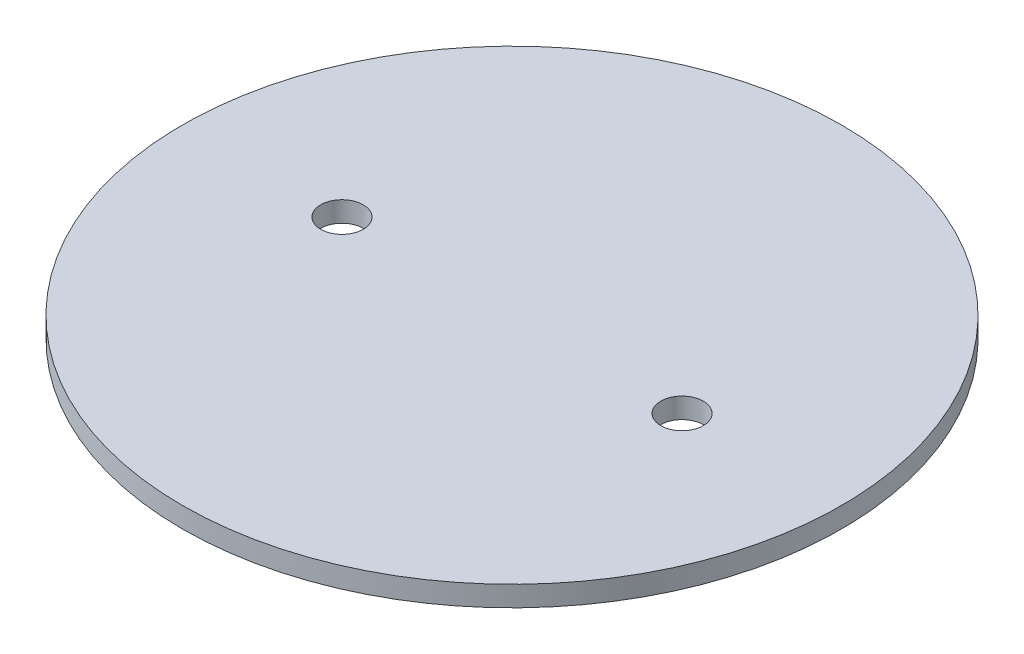
ISO-10303-21;
HEADER;
FILE_DESCRIPTION(('STEP AP214'),'2;1');
FILE_NAME('part.step','',(''),(''),'','','');
FILE_SCHEMA(('AUTOMOTIVE_DESIGN { 1 0 10303 214 1 1 1 1 }'));
ENDSEC;
DATA;
#1=APPLICATION_CONTEXT('core data for automotive mechanical design processes');
#2=APPLICATION_PROTOCOL_DEFINITION('international standard','automotive_design',2000,#1);
#3=PRODUCT_CONTEXT('',#1,'mechanical');
#4=PRODUCT('Part','Part','',(#3));
#5=PRODUCT_RELATED_PRODUCT_CATEGORY('part','',(#4));
#6=PRODUCT_DEFINITION_FORMATION('','',#4);
#7=PRODUCT_DEFINITION_CONTEXT('part definition',#1,'design');
#8=PRODUCT_DEFINITION('design','',#6,#7);
#9=PRODUCT_DEFINITION_SHAPE('','',#8);
#10=(LENGTH_UNIT() NAMED_UNIT(*) SI_UNIT(.MILLI.,.METRE.));
#11=(NAMED_UNIT(*) PLANE_ANGLE_UNIT() SI_UNIT($,.RADIAN.));
#12=(NAMED_UNIT(*) SI_UNIT($,.STERADIAN.) SOLID_ANGLE_UNIT());
#13=UNCERTAINTY_MEASURE_WITH_UNIT(LENGTH_MEASURE(1.E-05),#10,'distance_accuracy_value','');
#14=(GEOMETRIC_REPRESENTATION_CONTEXT(3) GLOBAL_UNCERTAINTY_ASSIGNED_CONTEXT((#13)) GLOBAL_UNIT_ASSIGNED_CONTEXT((#10,
#11,#12)) REPRESENTATION_CONTEXT('',''));
#15=CARTESIAN_POINT('',(0.,0.,0.));
#16=DIRECTION('',(0.,0.,1.));
#17=DIRECTION('',(1.,0.,0.));
#18=AXIS2_PLACEMENT_3D('',#15,#16,#17);
#19=CARTESIAN_POINT('',(0.,6.,0.));
#20=DIRECTION('',(0.,1.,0.));
#21=DIRECTION('',(0.,0.,1.));
#22=AXIS2_PLACEMENT_3D('',#19,#20,#21);
#23=PLANE('',#22);
#24=CARTESIAN_POINT('',(-50.,6.,0.));
#25=DIRECTION('',(0.,1.,0.));
#26=DIRECTION('',(0.,0.,1.));
#27=AXIS2_PLACEMENT_3D('',#24,#25,#26);
#28=CIRCLE('',#27,6.25);
#29=CARTESIAN_POINT('',(-50.,6.,6.25));
#30=VERTEX_POINT('',#29);
#31=EDGE_CURVE('E56',#30,#30,#28,.T.);
#32=ORIENTED_EDGE('',*,*,#31,.F.);
#33=EDGE_LOOP('',(#32));
#34=FACE_BOUND('',#33,.T.);
#35=CARTESIAN_POINT('',(0.,6.,0.));
#36=DIRECTION('',(0.,1.,0.));
#37=DIRECTION('',(0.,0.,1.));
#38=AXIS2_PLACEMENT_3D('',#35,#36,#37);
#39=CIRCLE('',#38,96.9);
#40=CARTESIAN_POINT('',(0.,6.,96.9));
#41=VERTEX_POINT('',#40);
#42=EDGE_CURVE('E10',#41,#41,#39,.T.);
#43=ORIENTED_EDGE('',*,*,#42,.T.);
#44=EDGE_LOOP('',(#43));
#45=FACE_BOUND('',#44,.T.);
#46=CARTESIAN_POINT('',(50.,6.,0.));
#47=DIRECTION('',(0.,1.,0.));
#48=DIRECTION('',(0.,0.,1.));
#49=AXIS2_PLACEMENT_3D('',#46,#47,#48);
#50=CIRCLE('',#49,6.25000000000001);
#51=CARTESIAN_POINT('',(50.,6.,6.25000000000001));
#52=VERTEX_POINT('',#51);
#53=EDGE_CURVE('E62',#52,#52,#50,.T.);
#54=ORIENTED_EDGE('',*,*,#53,.F.);
#55=EDGE_LOOP('',(#54));
#56=FACE_BOUND('',#55,.T.);
#57=ADVANCED_FACE('F43',(#34,#45,#56),#23,.T.);
#58=CARTESIAN_POINT('',(0.,0.,0.));
#59=DIRECTION('',(0.,1.,0.));
#60=DIRECTION('',(0.,0.,1.));
#61=AXIS2_PLACEMENT_3D('',#58,#59,#60);
#62=PLANE('',#61);
#63=CARTESIAN_POINT('',(0.,0.,0.));
#64=DIRECTION('',(0.,1.,0.));
#65=DIRECTION('',(0.,0.,1.));
#66=AXIS2_PLACEMENT_3D('',#63,#64,#65);
#67=CIRCLE('',#66,96.9);
#68=CARTESIAN_POINT('',(0.,0.,96.9));
#69=VERTEX_POINT('',#68);
#70=EDGE_CURVE('E47',#69,#69,#67,.T.);
#71=ORIENTED_EDGE('',*,*,#70,.F.);
#72=EDGE_LOOP('',(#71));
#73=FACE_BOUND('',#72,.T.);
#74=CARTESIAN_POINT('',(-50.,0.,0.));
#75=DIRECTION('',(0.,1.,0.));
#76=DIRECTION('',(0.,0.,1.));
#77=AXIS2_PLACEMENT_3D('',#74,#75,#76);
#78=CIRCLE('',#77,6.25);
#79=CARTESIAN_POINT('',(-50.,0.,6.25));
#80=VERTEX_POINT('',#79);
#81=EDGE_CURVE('E58',#80,#80,#78,.T.);
#82=ORIENTED_EDGE('',*,*,#81,.T.);
#83=EDGE_LOOP('',(#82));
#84=FACE_BOUND('',#83,.T.);
#85=CARTESIAN_POINT('',(50.,0.,0.));
#86=DIRECTION('',(0.,1.,0.));
#87=DIRECTION('',(0.,0.,1.));
#88=AXIS2_PLACEMENT_3D('',#85,#86,#87);
#89=CIRCLE('',#88,6.25000000000001);
#90=CARTESIAN_POINT('',(50.,0.,6.25000000000001));
#91=VERTEX_POINT('',#90);
#92=EDGE_CURVE('E66',#91,#91,#89,.T.);
#93=ORIENTED_EDGE('',*,*,#92,.T.);
#94=EDGE_LOOP('',(#93));
#95=FACE_BOUND('',#94,.T.);
#96=ADVANCED_FACE('F78',(#73,#84,#95),#62,.F.);
#97=CARTESIAN_POINT('',(0.,6.,0.));
#98=DIRECTION('',(0.,-1.,0.));
#99=DIRECTION('',(0.,0.,-1.));
#100=AXIS2_PLACEMENT_3D('',#97,#98,#99);
#101=CYLINDRICAL_SURFACE('',#100,96.9);
#102=ORIENTED_EDGE('',*,*,#42,.F.);
#103=EDGE_LOOP('',(#102));
#104=FACE_BOUND('',#103,.T.);
#105=ORIENTED_EDGE('',*,*,#70,.T.);
#106=EDGE_LOOP('',(#105));
#107=FACE_BOUND('',#106,.T.);
#108=ADVANCED_FACE('F45',(#104,#107),#101,.T.);
#109=CARTESIAN_POINT('',(-50.,6.,0.));
#110=DIRECTION('',(0.,-1.,0.));
#111=DIRECTION('',(0.,0.,-1.));
#112=AXIS2_PLACEMENT_3D('',#109,#110,#111);
#113=CYLINDRICAL_SURFACE('',#112,6.25);
#114=ORIENTED_EDGE('',*,*,#31,.T.);
#115=EDGE_LOOP('',(#114));
#116=FACE_BOUND('',#115,.T.);
#117=ORIENTED_EDGE('',*,*,#81,.F.);
#118=EDGE_LOOP('',(#117));
#119=FACE_BOUND('',#118,.T.);
#120=ADVANCED_FACE('F87',(#116,#119),#113,.F.);
#121=CARTESIAN_POINT('',(50.,6.,0.));
#122=DIRECTION('',(0.,-1.,0.));
#123=DIRECTION('',(0.,0.,-1.));
#124=AXIS2_PLACEMENT_3D('',#121,#122,#123);
#125=CYLINDRICAL_SURFACE('',#124,6.25000000000001);
#126=ORIENTED_EDGE('',*,*,#53,.T.);
#127=EDGE_LOOP('',(#126));
#128=FACE_BOUND('',#127,.T.);
#129=ORIENTED_EDGE('',*,*,#92,.F.);
#130=EDGE_LOOP('',(#129));
#131=FACE_BOUND('',#130,.T.);
#132=ADVANCED_FACE('F74',(#128,#131),#125,.F.);
#133=CLOSED_SHELL('',(#57,#96,#108,#120,#132));
#134=MANIFOLD_SOLID_BREP('B2',#133);
#135=ADVANCED_BREP_SHAPE_REPRESENTATION('',(#18,#134),#14);
#136=SHAPE_DEFINITION_REPRESENTATION(#9,#135);
ENDSEC;
END-ISO-10303-21;
